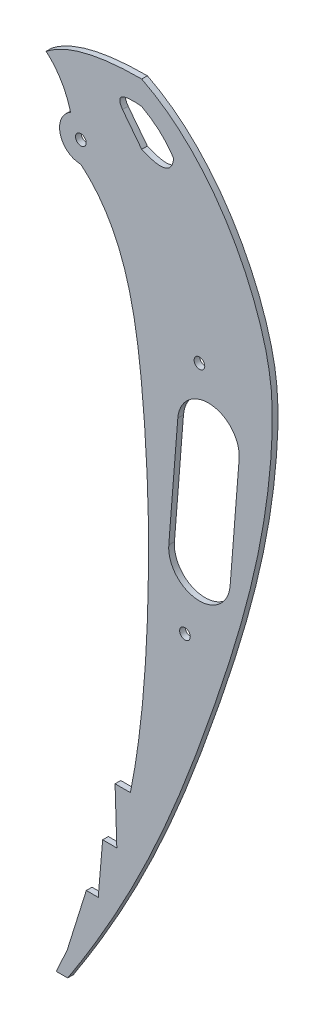
ISO-10303-21;
HEADER;
FILE_DESCRIPTION(('STEP AP214'),'2;1');
FILE_NAME('part.step','',(''),(''),'','','');
FILE_SCHEMA(('AUTOMOTIVE_DESIGN { 1 0 10303 214 1 1 1 1 }'));
ENDSEC;
DATA;
#1=APPLICATION_CONTEXT('core data for automotive mechanical design processes');
#2=APPLICATION_PROTOCOL_DEFINITION('international standard','automotive_design',2000,#1);
#3=PRODUCT_CONTEXT('',#1,'mechanical');
#4=PRODUCT('Part','Part','',(#3));
#5=PRODUCT_RELATED_PRODUCT_CATEGORY('part','',(#4));
#6=PRODUCT_DEFINITION_FORMATION('','',#4);
#7=PRODUCT_DEFINITION_CONTEXT('part definition',#1,'design');
#8=PRODUCT_DEFINITION('design','',#6,#7);
#9=PRODUCT_DEFINITION_SHAPE('','',#8);
#10=(LENGTH_UNIT() NAMED_UNIT(*) SI_UNIT(.MILLI.,.METRE.));
#11=(NAMED_UNIT(*) PLANE_ANGLE_UNIT() SI_UNIT($,.RADIAN.));
#12=(NAMED_UNIT(*) SI_UNIT($,.STERADIAN.) SOLID_ANGLE_UNIT());
#13=UNCERTAINTY_MEASURE_WITH_UNIT(LENGTH_MEASURE(1.E-05),#10,'distance_accuracy_value','');
#14=(GEOMETRIC_REPRESENTATION_CONTEXT(3) GLOBAL_UNCERTAINTY_ASSIGNED_CONTEXT((#13)) GLOBAL_UNIT_ASSIGNED_CONTEXT((#10,
#11,#12)) REPRESENTATION_CONTEXT('',''));
#15=CARTESIAN_POINT('',(0.,0.,0.));
#16=DIRECTION('',(0.,0.,1.));
#17=DIRECTION('',(1.,0.,0.));
#18=AXIS2_PLACEMENT_3D('',#15,#16,#17);
#19=CARTESIAN_POINT('',(-5.41935609574344,-10.162481193457,1.6));
#20=CARTESIAN_POINT('',(-1.88195097163764,-14.5842375985892,1.6));
#21=CARTESIAN_POINT('',(0.,-17.1688407122922,1.6));
#22=B_SPLINE_CURVE_WITH_KNOTS('',2,(#19,#20,#21),.UNSPECIFIED.,.F.,.F.,(3,3),(0.,1.),.UNSPECIFIED.);
#23=DIRECTION('',(0.,0.,-1.));
#24=VECTOR('',#23,1.);
#25=SURFACE_OF_LINEAR_EXTRUSION('',#22,#24);
#26=CARTESIAN_POINT('',(-5.41935609574344,-10.162481193457,0.));
#27=CARTESIAN_POINT('',(-1.88195097163764,-14.5842375985892,0.));
#28=CARTESIAN_POINT('',(0.,-17.1688407122922,0.));
#29=B_SPLINE_CURVE_WITH_KNOTS('',2,(#26,#27,#28),.UNSPECIFIED.,.F.,.F.,(3,3),(0.,1.),.UNSPECIFIED.);
#30=CARTESIAN_POINT('',(-5.41935609574344,-10.162481193457,0.));
#31=VERTEX_POINT('',#30);
#32=CARTESIAN_POINT('',(0.,-17.1688407122922,0.));
#33=VERTEX_POINT('',#32);
#34=EDGE_CURVE('E337',#31,#33,#29,.T.);
#35=ORIENTED_EDGE('',*,*,#34,.F.);
#36=DIRECTION('',(0.,0.,-1.));
#37=VECTOR('',#36,1.);
#38=CARTESIAN_POINT('',(-5.41935609574344,-10.162481193457,1.6));
#39=LINE('',#38,#37);
#40=CARTESIAN_POINT('',(-5.41935609574344,-10.162481193457,1.6));
#41=VERTEX_POINT('',#40);
#42=EDGE_CURVE('E11',#41,#31,#39,.T.);
#43=ORIENTED_EDGE('',*,*,#42,.F.);
#44=CARTESIAN_POINT('',(0.,-17.1688407122922,1.6));
#45=VERTEX_POINT('',#44);
#46=EDGE_CURVE('E200',#41,#45,#22,.T.);
#47=ORIENTED_EDGE('',*,*,#46,.T.);
#48=DIRECTION('',(0.,0.,-1.));
#49=VECTOR('',#48,1.);
#50=CARTESIAN_POINT('',(0.,-17.1688407122922,1.6));
#51=LINE('',#50,#49);
#52=EDGE_CURVE('E56',#45,#33,#51,.T.);
#53=ORIENTED_EDGE('',*,*,#52,.T.);
#54=EDGE_LOOP('',(#35,#43,#47,#53));
#55=FACE_BOUND('',#54,.T.);
#56=ADVANCED_FACE('F37',(#55),#25,.T.);
#57=CARTESIAN_POINT('',(-5.41935609574344,-10.162481193457,1.6));
#58=CARTESIAN_POINT('',(-8.38277856215761,-5.84075309128208,1.6));
#59=CARTESIAN_POINT('',(0.,-6.71629705377271,1.6));
#60=B_SPLINE_CURVE_WITH_KNOTS('',2,(#57,#58,#59),.UNSPECIFIED.,.F.,.F.,(3,3),(0.,1.),.UNSPECIFIED.);
#61=DIRECTION('',(0.,0.,-1.));
#62=VECTOR('',#61,1.);
#63=SURFACE_OF_LINEAR_EXTRUSION('',#60,#62);
#64=CARTESIAN_POINT('',(-5.41935609574344,-10.162481193457,0.));
#65=CARTESIAN_POINT('',(-8.38277856215761,-5.84075309128208,0.));
#66=CARTESIAN_POINT('',(0.,-6.71629705377271,0.));
#67=B_SPLINE_CURVE_WITH_KNOTS('',2,(#64,#65,#66),.UNSPECIFIED.,.F.,.F.,(3,3),(0.,1.),.UNSPECIFIED.);
#68=CARTESIAN_POINT('',(0.,-6.71629705377271,0.));
#69=VERTEX_POINT('',#68);
#70=EDGE_CURVE('E205',#31,#69,#67,.T.);
#71=ORIENTED_EDGE('',*,*,#70,.T.);
#72=DIRECTION('',(0.,0.,-1.));
#73=VECTOR('',#72,1.);
#74=CARTESIAN_POINT('',(0.,-6.71629705377271,1.6));
#75=LINE('',#74,#73);
#76=CARTESIAN_POINT('',(0.,-6.71629705377271,1.6));
#77=VERTEX_POINT('',#76);
#78=EDGE_CURVE('E47',#77,#69,#75,.T.);
#79=ORIENTED_EDGE('',*,*,#78,.F.);
#80=EDGE_CURVE('E195',#41,#77,#60,.T.);
#81=ORIENTED_EDGE('',*,*,#80,.F.);
#82=ORIENTED_EDGE('',*,*,#42,.T.);
#83=EDGE_LOOP('',(#71,#79,#81,#82));
#84=FACE_BOUND('',#83,.T.);
#85=ADVANCED_FACE('F203',(#84),#63,.F.);
#86=CARTESIAN_POINT('',(0.,-6.71629705377271,1.6));
#87=CARTESIAN_POINT('',(5.91198843757165,-9.94948890715059,1.6));
#88=CARTESIAN_POINT('',(8.98701845188216,-14.8810498489991,1.6));
#89=B_SPLINE_CURVE_WITH_KNOTS('',2,(#86,#87,#88),.UNSPECIFIED.,.F.,.F.,(3,3),(0.,1.),.UNSPECIFIED.);
#90=DIRECTION('',(0.,0.,-1.));
#91=VECTOR('',#90,1.);
#92=SURFACE_OF_LINEAR_EXTRUSION('',#89,#91);
#93=CARTESIAN_POINT('',(0.,-6.71629705377271,0.));
#94=CARTESIAN_POINT('',(5.91198843757165,-9.94948890715059,0.));
#95=CARTESIAN_POINT('',(8.98701845188216,-14.8810498489991,0.));
#96=B_SPLINE_CURVE_WITH_KNOTS('',2,(#93,#94,#95),.UNSPECIFIED.,.F.,.F.,(3,3),(0.,1.),.UNSPECIFIED.);
#97=CARTESIAN_POINT('',(8.98701845188216,-14.8810498489991,0.));
#98=VERTEX_POINT('',#97);
#99=EDGE_CURVE('E350',#69,#98,#96,.T.);
#100=ORIENTED_EDGE('',*,*,#99,.T.);
#101=DIRECTION('',(0.,0.,-1.));
#102=VECTOR('',#101,1.);
#103=CARTESIAN_POINT('',(8.98701845188216,-14.8810498489991,1.6));
#104=LINE('',#103,#102);
#105=CARTESIAN_POINT('',(8.98701845188216,-14.8810498489991,1.6));
#106=VERTEX_POINT('',#105);
#107=EDGE_CURVE('E121',#106,#98,#104,.T.);
#108=ORIENTED_EDGE('',*,*,#107,.F.);
#109=EDGE_CURVE('E187',#77,#106,#89,.T.);
#110=ORIENTED_EDGE('',*,*,#109,.F.);
#111=ORIENTED_EDGE('',*,*,#78,.T.);
#112=EDGE_LOOP('',(#100,#108,#110,#111));
#113=FACE_BOUND('',#112,.T.);
#114=ADVANCED_FACE('F189',(#113),#92,.F.);
#115=CARTESIAN_POINT('',(-20.0529924564139,-18.1595476396093,1.6));
#116=CARTESIAN_POINT('',(-21.8935823896308,-11.067218770567,1.6));
#117=CARTESIAN_POINT('',(-26.9696577258909,-6.71629705377271,1.6));
#118=B_SPLINE_CURVE_WITH_KNOTS('',2,(#115,#116,#117),.UNSPECIFIED.,.F.,.F.,(3,3),(0.,1.),.UNSPECIFIED.);
#119=DIRECTION('',(0.,0.,-1.));
#120=VECTOR('',#119,1.);
#121=SURFACE_OF_LINEAR_EXTRUSION('',#118,#120);
#122=CARTESIAN_POINT('',(-20.0529924564139,-18.1595476396093,0.));
#123=CARTESIAN_POINT('',(-21.8935823896308,-11.067218770567,0.));
#124=CARTESIAN_POINT('',(-26.9696577258909,-6.71629705377271,0.));
#125=B_SPLINE_CURVE_WITH_KNOTS('',2,(#122,#123,#124),.UNSPECIFIED.,.F.,.F.,(3,3),(0.,1.),.UNSPECIFIED.);
#126=CARTESIAN_POINT('',(-20.0529924564139,-18.1595476396093,0.));
#127=VERTEX_POINT('',#126);
#128=CARTESIAN_POINT('',(-26.9696577258909,-6.71629705377271,0.));
#129=VERTEX_POINT('',#128);
#130=EDGE_CURVE('E281',#127,#129,#125,.T.);
#131=ORIENTED_EDGE('',*,*,#130,.F.);
#132=DIRECTION('',(0.,0.,-1.));
#133=VECTOR('',#132,1.);
#134=CARTESIAN_POINT('',(-20.0529924564139,-18.1595476396093,1.6));
#135=LINE('',#134,#133);
#136=CARTESIAN_POINT('',(-20.0529924564139,-18.1595476396093,1.6));
#137=VERTEX_POINT('',#136);
#138=EDGE_CURVE('E242',#137,#127,#135,.T.);
#139=ORIENTED_EDGE('',*,*,#138,.F.);
#140=CARTESIAN_POINT('',(-26.9696577258909,-6.71629705377271,1.6));
#141=VERTEX_POINT('',#140);
#142=EDGE_CURVE('E387',#137,#141,#118,.T.);
#143=ORIENTED_EDGE('',*,*,#142,.T.);
#144=DIRECTION('',(0.,0.,-1.));
#145=VECTOR('',#144,1.);
#146=CARTESIAN_POINT('',(-26.9696577258909,-6.71629705377271,1.6));
#147=LINE('',#146,#145);
#148=EDGE_CURVE('E210',#141,#129,#147,.T.);
#149=ORIENTED_EDGE('',*,*,#148,.T.);
#150=EDGE_LOOP('',(#131,#139,#143,#149));
#151=FACE_BOUND('',#150,.T.);
#152=ADVANCED_FACE('F399',(#151),#121,.T.);
#153=CARTESIAN_POINT('',(-17.160324035342,-23.4162071687907,1.6));
#154=DIRECTION('',(0.,0.,-1.));
#155=DIRECTION('',(-1.,0.,0.));
#156=AXIS2_PLACEMENT_3D('',#153,#154,#155);
#157=CYLINDRICAL_SURFACE('',#156,6.);
#158=CARTESIAN_POINT('',(-17.160324035342,-23.4162071687907,0.));
#159=DIRECTION('',(0.,0.,1.));
#160=DIRECTION('',(1.,0.,0.));
#161=AXIS2_PLACEMENT_3D('',#158,#159,#160);
#162=CIRCLE('',#161,6.);
#163=CARTESIAN_POINT('',(-17.160324035342,-29.4162071687907,0.));
#164=VERTEX_POINT('',#163);
#165=EDGE_CURVE('E286',#127,#164,#162,.T.);
#166=ORIENTED_EDGE('',*,*,#165,.T.);
#167=DIRECTION('',(0.,0.,-1.));
#168=VECTOR('',#167,1.);
#169=CARTESIAN_POINT('',(-17.160324035342,-29.4162071687907,1.6));
#170=LINE('',#169,#168);
#171=CARTESIAN_POINT('',(-17.160324035342,-29.4162071687907,1.6));
#172=VERTEX_POINT('',#171);
#173=EDGE_CURVE('E239',#172,#164,#170,.T.);
#174=ORIENTED_EDGE('',*,*,#173,.F.);
#175=CARTESIAN_POINT('',(-17.160324035342,-23.4162071687907,1.6));
#176=DIRECTION('',(0.,0.,1.));
#177=DIRECTION('',(1.,0.,0.));
#178=AXIS2_PLACEMENT_3D('',#175,#176,#177);
#179=CIRCLE('',#178,6.);
#180=EDGE_CURVE('E393',#137,#172,#179,.T.);
#181=ORIENTED_EDGE('',*,*,#180,.F.);
#182=ORIENTED_EDGE('',*,*,#138,.T.);
#183=EDGE_LOOP('',(#166,#174,#181,#182));
#184=FACE_BOUND('',#183,.T.);
#185=ADVANCED_FACE('F403',(#184),#157,.T.);
#186=CARTESIAN_POINT('',(-17.160324035342,-29.4162071687907,1.6));
#187=CARTESIAN_POINT('',(-8.39837101061854,-36.7334757061645,1.6));
#188=CARTESIAN_POINT('',(-2.57158426841968,-52.9686987777936,1.6));
#189=CARTESIAN_POINT('',(0.661081286815977,-79.111086987168,1.6));
#190=CARTESIAN_POINT('',(2.20508208350334,-105.054570558527,1.6));
#191=CARTESIAN_POINT('',(1.83779525450955,-131.716022714708,1.6));
#192=CARTESIAN_POINT('',(0.137887281305669,-155.63401396644,1.6));
#193=CARTESIAN_POINT('',(-1.77194083310882,-168.86774135152,1.6));
#194=CARTESIAN_POINT('',(-3.18703668983481,-175.881884889876,1.6));
#195=B_SPLINE_CURVE_WITH_KNOTS('',3,(#186,#187,#188,#189,#190,#191,#192,#193,#194),
.UNSPECIFIED.,.F.,.F.,(4,1,1,1,1,1,4),(0.,0.158482102906718,0.237210378491598,0.379017678335103,
0.530540030476529,0.619678160333322,0.722683628542991),.UNSPECIFIED.);
#196=DIRECTION('',(0.,0.,-1.));
#197=VECTOR('',#196,1.);
#198=SURFACE_OF_LINEAR_EXTRUSION('',#195,#197);
#199=CARTESIAN_POINT('',(-17.160324035342,-29.4162071687907,0.));
#200=CARTESIAN_POINT('',(-8.39837101061854,-36.7334757061645,0.));
#201=CARTESIAN_POINT('',(-2.57158426841968,-52.9686987777936,0.));
#202=CARTESIAN_POINT('',(0.661081286815977,-79.111086987168,0.));
#203=CARTESIAN_POINT('',(2.20508208350334,-105.054570558527,0.));
#204=CARTESIAN_POINT('',(1.83779525450955,-131.716022714708,0.));
#205=CARTESIAN_POINT('',(0.137887281305669,-155.63401396644,0.));
#206=CARTESIAN_POINT('',(-1.77194083310882,-168.86774135152,0.));
#207=CARTESIAN_POINT('',(-3.18703668983481,-175.881884889876,0.));
#208=B_SPLINE_CURVE_WITH_KNOTS('',3,(#199,#200,#201,#202,#203,#204,#205,#206,#207),
.UNSPECIFIED.,.F.,.F.,(4,1,1,1,1,1,4),(0.,0.158482102906718,0.237210378491598,0.379017678335103,
0.530540030476529,0.619678160333322,0.722683628542991),.UNSPECIFIED.);
#209=CARTESIAN_POINT('',(-3.18703668983481,-175.881884889876,0.));
#210=VERTEX_POINT('',#209);
#211=EDGE_CURVE('E292',#164,#210,#208,.T.);
#212=ORIENTED_EDGE('',*,*,#211,.T.);
#213=DIRECTION('',(0.,0.,-1.));
#214=VECTOR('',#213,1.);
#215=CARTESIAN_POINT('',(-3.18703668983481,-175.881884889876,1.6));
#216=LINE('',#215,#214);
#217=CARTESIAN_POINT('',(-3.18703668983481,-175.881884889876,1.6));
#218=VERTEX_POINT('',#217);
#219=EDGE_CURVE('E236',#218,#210,#216,.T.);
#220=ORIENTED_EDGE('',*,*,#219,.F.);
#221=EDGE_CURVE('E497',#172,#218,#195,.T.);
#222=ORIENTED_EDGE('',*,*,#221,.F.);
#223=ORIENTED_EDGE('',*,*,#173,.T.);
#224=EDGE_LOOP('',(#212,#220,#222,#223));
#225=FACE_BOUND('',#224,.T.);
#226=ADVANCED_FACE('F510',(#225),#198,.F.);
#227=CARTESIAN_POINT('',(0.,-175.881884889876,1.6));
#228=DIRECTION('',(0.,-1.,0.));
#229=DIRECTION('',(0.,0.,-1.));
#230=AXIS2_PLACEMENT_3D('',#227,#228,#229);
#231=PLANE('',#230);
#232=DIRECTION('',(-1.,0.,0.));
#233=VECTOR('',#232,1.);
#234=CARTESIAN_POINT('',(0.,-175.881884889876,0.));
#235=LINE('',#234,#233);
#236=CARTESIAN_POINT('',(-7.51601253221282,-175.881884889876,0.));
#237=VERTEX_POINT('',#236);
#238=EDGE_CURVE('E297',#210,#237,#235,.T.);
#239=ORIENTED_EDGE('',*,*,#238,.T.);
#240=DIRECTION('',(0.,0.,-1.));
#241=VECTOR('',#240,1.);
#242=CARTESIAN_POINT('',(-7.51601253221282,-175.881884889876,1.6));
#243=LINE('',#242,#241);
#244=CARTESIAN_POINT('',(-7.51601253221282,-175.881884889876,1.6));
#245=VERTEX_POINT('',#244);
#246=EDGE_CURVE('E233',#245,#237,#243,.T.);
#247=ORIENTED_EDGE('',*,*,#246,.F.);
#248=DIRECTION('',(-1.,0.,0.));
#249=VECTOR('',#248,1.);
#250=CARTESIAN_POINT('',(0.,-175.881884889876,1.6));
#251=LINE('',#250,#249);
#252=EDGE_CURVE('E498',#218,#245,#251,.T.);
#253=ORIENTED_EDGE('',*,*,#252,.F.);
#254=ORIENTED_EDGE('',*,*,#219,.T.);
#255=EDGE_LOOP('',(#239,#247,#253,#254));
#256=FACE_BOUND('',#255,.T.);
#257=ADVANCED_FACE('F513',(#256),#231,.F.);
#258=CARTESIAN_POINT('',(-13.1552459237664,-0.422808004032004,1.6));
#259=DIRECTION('',(0.999483913901284,0.0321232914342744,0.));
#260=DIRECTION('',(-0.0321232914342744,0.999483913901284,0.));
#261=AXIS2_PLACEMENT_3D('',#258,#259,#260);
#262=PLANE('',#261);
#263=DIRECTION('',(0.0321232914342744,-0.999483913901284,0.));
#264=VECTOR('',#263,1.);
#265=CARTESIAN_POINT('',(-13.1552459237664,-0.422808004032004,0.));
#266=LINE('',#265,#264);
#267=CARTESIAN_POINT('',(-7.02010282232688,-191.311616889555,0.));
#268=VERTEX_POINT('',#267);
#269=EDGE_CURVE('E303',#237,#268,#266,.T.);
#270=ORIENTED_EDGE('',*,*,#269,.T.);
#271=DIRECTION('',(0.,0.,-1.));
#272=VECTOR('',#271,1.);
#273=CARTESIAN_POINT('',(-7.02010282232688,-191.311616889555,1.6));
#274=LINE('',#273,#272);
#275=CARTESIAN_POINT('',(-7.02010282232688,-191.311616889555,1.6));
#276=VERTEX_POINT('',#275);
#277=EDGE_CURVE('E230',#276,#268,#274,.T.);
#278=ORIENTED_EDGE('',*,*,#277,.F.);
#279=DIRECTION('',(0.0321232914342744,-0.999483913901284,0.));
#280=VECTOR('',#279,1.);
#281=CARTESIAN_POINT('',(-13.1552459237664,-0.422808004032004,1.6));
#282=LINE('',#281,#280);
#283=EDGE_CURVE('E501',#245,#276,#282,.T.);
#284=ORIENTED_EDGE('',*,*,#283,.F.);
#285=ORIENTED_EDGE('',*,*,#246,.T.);
#286=EDGE_LOOP('',(#270,#278,#284,#285));
#287=FACE_BOUND('',#286,.T.);
#288=ADVANCED_FACE('F517',(#287),#262,.F.);
#289=CARTESIAN_POINT('',(0.,-191.311616889555,1.6));
#290=DIRECTION('',(0.,-1.,0.));
#291=DIRECTION('',(0.,0.,-1.));
#292=AXIS2_PLACEMENT_3D('',#289,#290,#291);
#293=PLANE('',#292);
#294=DIRECTION('',(-1.,0.,0.));
#295=VECTOR('',#294,1.);
#296=CARTESIAN_POINT('',(0.,-191.311616889555,0.));
#297=LINE('',#296,#295);
#298=CARTESIAN_POINT('',(-11.0217381598174,-191.311616889555,0.));
#299=VERTEX_POINT('',#298);
#300=EDGE_CURVE('E306',#268,#299,#297,.T.);
#301=ORIENTED_EDGE('',*,*,#300,.T.);
#302=DIRECTION('',(0.,0.,-1.));
#303=VECTOR('',#302,1.);
#304=CARTESIAN_POINT('',(-11.0217381598174,-191.311616889555,1.6));
#305=LINE('',#304,#303);
#306=CARTESIAN_POINT('',(-11.0217381598174,-191.311616889555,1.6));
#307=VERTEX_POINT('',#306);
#308=EDGE_CURVE('E227',#307,#299,#305,.T.);
#309=ORIENTED_EDGE('',*,*,#308,.F.);
#310=DIRECTION('',(-1.,0.,0.));
#311=VECTOR('',#310,1.);
#312=CARTESIAN_POINT('',(0.,-191.311616889555,1.6));
#313=LINE('',#312,#311);
#314=EDGE_CURVE('E570',#276,#307,#313,.T.);
#315=ORIENTED_EDGE('',*,*,#314,.F.);
#316=ORIENTED_EDGE('',*,*,#277,.T.);
#317=EDGE_LOOP('',(#301,#309,#315,#316));
#318=FACE_BOUND('',#317,.T.);
#319=ADVANCED_FACE('F521',(#318),#293,.F.);
#320=CARTESIAN_POINT('',(5.06343246458469,-0.426676798594854,1.6));
#321=DIRECTION('',(0.996468390898167,-0.083968720014175,0.));
#322=DIRECTION('',(0.083968720014175,0.996468390898166,0.));
#323=AXIS2_PLACEMENT_3D('',#320,#321,#322);
#324=PLANE('',#323);
#325=DIRECTION('',(-0.083968720014175,-0.996468390898167,0.));
#326=VECTOR('',#325,1.);
#327=CARTESIAN_POINT('',(5.06343246458469,-0.426676798594854,0.));
#328=LINE('',#327,#326);
#329=CARTESIAN_POINT('',(-12.2589606060334,-205.993906436851,0.));
#330=VERTEX_POINT('',#329);
#331=EDGE_CURVE('E309',#299,#330,#328,.T.);
#332=ORIENTED_EDGE('',*,*,#331,.T.);
#333=DIRECTION('',(0.,0.,-1.));
#334=VECTOR('',#333,1.);
#335=CARTESIAN_POINT('',(-12.2589606060334,-205.993906436851,1.6));
#336=LINE('',#335,#334);
#337=CARTESIAN_POINT('',(-12.2589606060334,-205.993906436851,1.6));
#338=VERTEX_POINT('',#337);
#339=EDGE_CURVE('E224',#338,#330,#336,.T.);
#340=ORIENTED_EDGE('',*,*,#339,.F.);
#341=DIRECTION('',(-0.083968720014175,-0.996468390898167,0.));
#342=VECTOR('',#341,1.);
#343=CARTESIAN_POINT('',(5.06343246458469,-0.426676798594854,1.6));
#344=LINE('',#343,#342);
#345=EDGE_CURVE('E567',#307,#338,#344,.T.);
#346=ORIENTED_EDGE('',*,*,#345,.F.);
#347=ORIENTED_EDGE('',*,*,#308,.T.);
#348=EDGE_LOOP('',(#332,#340,#346,#347));
#349=FACE_BOUND('',#348,.T.);
#350=ADVANCED_FACE('F525',(#349),#324,.F.);
#351=CARTESIAN_POINT('',(0.,-205.993906436851,1.6));
#352=DIRECTION('',(0.,-1.,0.));
#353=DIRECTION('',(0.,0.,-1.));
#354=AXIS2_PLACEMENT_3D('',#351,#352,#353);
#355=PLANE('',#354);
#356=DIRECTION('',(-1.,0.,0.));
#357=VECTOR('',#356,1.);
#358=CARTESIAN_POINT('',(0.,-205.993906436851,0.));
#359=LINE('',#358,#357);
#360=CARTESIAN_POINT('',(-15.6230030460485,-205.993906436851,0.));
#361=VERTEX_POINT('',#360);
#362=EDGE_CURVE('E312',#330,#361,#359,.T.);
#363=ORIENTED_EDGE('',*,*,#362,.T.);
#364=DIRECTION('',(0.,0.,-1.));
#365=VECTOR('',#364,1.);
#366=CARTESIAN_POINT('',(-15.6230030460485,-205.993906436851,1.6));
#367=LINE('',#366,#365);
#368=CARTESIAN_POINT('',(-15.6230030460485,-205.993906436851,1.6));
#369=VERTEX_POINT('',#368);
#370=EDGE_CURVE('E221',#369,#361,#367,.T.);
#371=ORIENTED_EDGE('',*,*,#370,.F.);
#372=DIRECTION('',(-1.,0.,0.));
#373=VECTOR('',#372,1.);
#374=CARTESIAN_POINT('',(0.,-205.993906436851,1.6));
#375=LINE('',#374,#373);
#376=EDGE_CURVE('E564',#338,#369,#375,.T.);
#377=ORIENTED_EDGE('',*,*,#376,.F.);
#378=ORIENTED_EDGE('',*,*,#339,.T.);
#379=EDGE_LOOP('',(#363,#371,#377,#378));
#380=FACE_BOUND('',#379,.T.);
#381=ADVANCED_FACE('F529',(#380),#355,.F.);
#382=CARTESIAN_POINT('',(44.4261041788893,-13.8867715394829,1.6));
#383=DIRECTION('',(0.954457870523093,-0.298345727967609,0.));
#384=DIRECTION('',(0.298345727967609,0.954457870523093,0.));
#385=AXIS2_PLACEMENT_3D('',#382,#383,#384);
#386=PLANE('',#385);
#387=DIRECTION('',(-0.298345727967609,-0.954457870523093,0.));
#388=VECTOR('',#387,1.);
#389=CARTESIAN_POINT('',(44.4261041788893,-13.8867715394829,0.));
#390=LINE('',#389,#388);
#391=CARTESIAN_POINT('',(-21.0272185928794,-223.282895616666,0.));
#392=VERTEX_POINT('',#391);
#393=EDGE_CURVE('E315',#361,#392,#390,.T.);
#394=ORIENTED_EDGE('',*,*,#393,.T.);
#395=DIRECTION('',(0.,0.,-1.));
#396=VECTOR('',#395,1.);
#397=CARTESIAN_POINT('',(-21.0272185928794,-223.282895616666,1.6));
#398=LINE('',#397,#396);
#399=CARTESIAN_POINT('',(-21.0272185928794,-223.282895616666,1.6));
#400=VERTEX_POINT('',#399);
#401=EDGE_CURVE('E218',#400,#392,#398,.T.);
#402=ORIENTED_EDGE('',*,*,#401,.F.);
#403=DIRECTION('',(-0.298345727967609,-0.954457870523093,0.));
#404=VECTOR('',#403,1.);
#405=CARTESIAN_POINT('',(44.4261041788893,-13.8867715394829,1.6));
#406=LINE('',#405,#404);
#407=EDGE_CURVE('E561',#369,#400,#406,.T.);
#408=ORIENTED_EDGE('',*,*,#407,.F.);
#409=ORIENTED_EDGE('',*,*,#370,.T.);
#410=EDGE_LOOP('',(#394,#402,#408,#409));
#411=FACE_BOUND('',#410,.T.);
#412=ADVANCED_FACE('F533',(#411),#386,.F.);
#413=CARTESIAN_POINT('',(67.2296065256395,-30.8309210013598,1.6));
#414=DIRECTION('',(0.908975944313388,-0.416848572817018,0.));
#415=DIRECTION('',(0.416848572817018,0.908975944313388,0.));
#416=AXIS2_PLACEMENT_3D('',#413,#414,#415);
#417=PLANE('',#416);
#418=DIRECTION('',(-0.416848572817018,-0.908975944313388,0.));
#419=VECTOR('',#418,1.);
#420=CARTESIAN_POINT('',(67.2296065256395,-30.8309210013598,0.));
#421=LINE('',#420,#419);
#422=CARTESIAN_POINT('',(-24.1076250581691,-230.,0.));
#423=VERTEX_POINT('',#422);
#424=EDGE_CURVE('E318',#392,#423,#421,.T.);
#425=ORIENTED_EDGE('',*,*,#424,.T.);
#426=DIRECTION('',(0.,0.,-1.));
#427=VECTOR('',#426,1.);
#428=CARTESIAN_POINT('',(-24.1076250581691,-230.,1.6));
#429=LINE('',#428,#427);
#430=CARTESIAN_POINT('',(-24.1076250581691,-230.,1.6));
#431=VERTEX_POINT('',#430);
#432=EDGE_CURVE('E216',#431,#423,#429,.T.);
#433=ORIENTED_EDGE('',*,*,#432,.F.);
#434=DIRECTION('',(-0.416848572817018,-0.908975944313388,0.));
#435=VECTOR('',#434,1.);
#436=CARTESIAN_POINT('',(67.2296065256395,-30.8309210013598,1.6));
#437=LINE('',#436,#435);
#438=EDGE_CURVE('E559',#400,#431,#437,.T.);
#439=ORIENTED_EDGE('',*,*,#438,.F.);
#440=ORIENTED_EDGE('',*,*,#401,.T.);
#441=EDGE_LOOP('',(#425,#433,#439,#440));
#442=FACE_BOUND('',#441,.T.);
#443=ADVANCED_FACE('F537',(#442),#417,.F.);
#444=CARTESIAN_POINT('',(0.,-230.,1.6));
#445=DIRECTION('',(0.,-1.,0.));
#446=DIRECTION('',(0.,0.,-1.));
#447=AXIS2_PLACEMENT_3D('',#444,#445,#446);
#448=PLANE('',#447);
#449=DIRECTION('',(-1.,0.,0.));
#450=VECTOR('',#449,1.);
#451=CARTESIAN_POINT('',(0.,-230.,0.));
#452=LINE('',#451,#450);
#453=CARTESIAN_POINT('',(-20.8747621989633,-230.,0.));
#454=VERTEX_POINT('',#453);
#455=EDGE_CURVE('E321',#454,#423,#452,.T.);
#456=ORIENTED_EDGE('',*,*,#455,.F.);
#457=DIRECTION('',(0.,0.,-1.));
#458=VECTOR('',#457,1.);
#459=CARTESIAN_POINT('',(-20.8747621989633,-230.,1.6));
#460=LINE('',#459,#458);
#461=CARTESIAN_POINT('',(-20.8747621989633,-230.,1.6));
#462=VERTEX_POINT('',#461);
#463=EDGE_CURVE('E214',#462,#454,#460,.T.);
#464=ORIENTED_EDGE('',*,*,#463,.F.);
#465=DIRECTION('',(-1.,0.,0.));
#466=VECTOR('',#465,1.);
#467=CARTESIAN_POINT('',(0.,-230.,1.6));
#468=LINE('',#467,#466);
#469=EDGE_CURVE('E553',#462,#431,#468,.T.);
#470=ORIENTED_EDGE('',*,*,#469,.T.);
#471=ORIENTED_EDGE('',*,*,#432,.T.);
#472=EDGE_LOOP('',(#456,#464,#470,#471));
#473=FACE_BOUND('',#472,.T.);
#474=ADVANCED_FACE('F541',(#473),#448,.T.);
#475=CARTESIAN_POINT('',(0.,0.,1.6));
#476=CARTESIAN_POINT('',(20.4595753055473,-10.2121918467981,1.6));
#477=CARTESIAN_POINT('',(34.5662851941913,-39.2317131576054,1.6));
#478=CARTESIAN_POINT('',(36.9930524523849,-61.4677114831442,1.6));
#479=CARTESIAN_POINT('',(36.2263830181213,-93.4939225691744,1.6));
#480=CARTESIAN_POINT('',(19.7597907232029,-148.871722199701,1.6));
#481=CARTESIAN_POINT('',(-0.764820519320112,-199.159242316598,1.6));
#482=CARTESIAN_POINT('',(-20.8747621989633,-230.,1.6));
#483=B_SPLINE_CURVE_WITH_KNOTS('',3,(#475,#476,#477,#478,#479,#480,#481,#482),.UNSPECIFIED.,.F.,
.F.,(4,1,1,1,1,4),(0.,0.214563454030827,0.244193693047157,0.296302390163298,0.63393732805005,
1.),.UNSPECIFIED.);
#484=DIRECTION('',(0.,0.,-1.));
#485=VECTOR('',#484,1.);
#486=SURFACE_OF_LINEAR_EXTRUSION('',#483,#485);
#487=CARTESIAN_POINT('',(0.,0.,0.));
#488=CARTESIAN_POINT('',(20.4595753055473,-10.2121918467981,0.));
#489=CARTESIAN_POINT('',(34.5662851941913,-39.2317131576054,0.));
#490=CARTESIAN_POINT('',(36.9930524523849,-61.4677114831442,0.));
#491=CARTESIAN_POINT('',(36.2263830181213,-93.4939225691744,0.));
#492=CARTESIAN_POINT('',(19.7597907232029,-148.871722199701,0.));
#493=CARTESIAN_POINT('',(-0.764820519320112,-199.159242316598,0.));
#494=CARTESIAN_POINT('',(-20.8747621989633,-230.,0.));
#495=B_SPLINE_CURVE_WITH_KNOTS('',3,(#487,#488,#489,#490,#491,#492,#493,#494),.UNSPECIFIED.,.F.,
.F.,(4,1,1,1,1,4),(0.,0.214563454030827,0.244193693047157,0.296302390163298,0.63393732805005,
1.),.UNSPECIFIED.);
#496=CARTESIAN_POINT('',(0.,0.,0.));
#497=VERTEX_POINT('',#496);
#498=EDGE_CURVE('E324',#497,#454,#495,.T.);
#499=ORIENTED_EDGE('',*,*,#498,.F.);
#500=DIRECTION('',(0.,0.,-1.));
#501=VECTOR('',#500,1.);
#502=CARTESIAN_POINT('',(0.,0.,1.6));
#503=LINE('',#502,#501);
#504=CARTESIAN_POINT('',(0.,0.,1.6));
#505=VERTEX_POINT('',#504);
#506=EDGE_CURVE('E212',#505,#497,#503,.T.);
#507=ORIENTED_EDGE('',*,*,#506,.F.);
#508=EDGE_CURVE('E547',#505,#462,#483,.T.);
#509=ORIENTED_EDGE('',*,*,#508,.T.);
#510=ORIENTED_EDGE('',*,*,#463,.T.);
#511=EDGE_LOOP('',(#499,#507,#509,#510));
#512=FACE_BOUND('',#511,.T.);
#513=ADVANCED_FACE('F422',(#512),#486,.T.);
#514=CARTESIAN_POINT('',(16.2801657128775,-110.65523614991,1.6));
#515=DIRECTION('',(0.,0.,-1.));
#516=DIRECTION('',(-1.,0.,0.));
#517=AXIS2_PLACEMENT_3D('',#514,#515,#516);
#518=CYLINDRICAL_SURFACE('',#517,8.67496910401254);
#519=CARTESIAN_POINT('',(16.2801657128775,-110.65523614991,0.));
#520=DIRECTION('',(0.,0.,1.));
#521=DIRECTION('',(1.,0.,0.));
#522=AXIS2_PLACEMENT_3D('',#519,#520,#521);
#523=CIRCLE('',#522,8.67496910401254);
#524=CARTESIAN_POINT('',(7.63218347510054,-109.971502158751,0.));
#525=VERTEX_POINT('',#524);
#526=CARTESIAN_POINT('',(24.9281479506546,-111.338970141068,0.));
#527=VERTEX_POINT('',#526);
#528=EDGE_CURVE('E261',#525,#527,#523,.T.);
#529=ORIENTED_EDGE('',*,*,#528,.F.);
#530=DIRECTION('',(0.,0.,-1.));
#531=VECTOR('',#530,1.);
#532=CARTESIAN_POINT('',(7.63218347510054,-109.971502158751,1.6));
#533=LINE('',#532,#531);
#534=CARTESIAN_POINT('',(7.63218347510054,-109.971502158751,1.6));
#535=VERTEX_POINT('',#534);
#536=EDGE_CURVE('E41',#535,#525,#533,.T.);
#537=ORIENTED_EDGE('',*,*,#536,.F.);
#538=CARTESIAN_POINT('',(16.2801657128775,-110.65523614991,1.6));
#539=DIRECTION('',(0.,0.,1.));
#540=DIRECTION('',(1.,0.,0.));
#541=AXIS2_PLACEMENT_3D('',#538,#539,#540);
#542=CIRCLE('',#541,8.67496910401254);
#543=CARTESIAN_POINT('',(24.9281479506546,-111.338970141068,1.6));
#544=VERTEX_POINT('',#543);
#545=EDGE_CURVE('E375',#535,#544,#542,.T.);
#546=ORIENTED_EDGE('',*,*,#545,.T.);
#547=DIRECTION('',(0.,0.,-1.));
#548=VECTOR('',#547,1.);
#549=CARTESIAN_POINT('',(24.9281479506546,-111.338970141068,1.6));
#550=LINE('',#549,#548);
#551=EDGE_CURVE('E244',#544,#527,#550,.T.);
#552=ORIENTED_EDGE('',*,*,#551,.T.);
#553=EDGE_LOOP('',(#529,#537,#546,#552));
#554=FACE_BOUND('',#553,.T.);
#555=ADVANCED_FACE('F262',(#554),#518,.F.);
#556=CARTESIAN_POINT('',(16.2254182013621,-1.28282755907743,1.6));
#557=DIRECTION('',(0.996889110968355,-0.0788168791105212,0.));
#558=DIRECTION('',(0.0788168791105212,0.996889110968355,0.));
#559=AXIS2_PLACEMENT_3D('',#556,#557,#558);
#560=PLANE('',#559);
#561=DIRECTION('',(-0.0788168791105213,-0.996889110968355,0.));
#562=VECTOR('',#561,1.);
#563=CARTESIAN_POINT('',(16.2254182013621,-1.28282755907743,0.));
#564=LINE('',#563,#562);
#565=CARTESIAN_POINT('',(10.1832179276029,-77.7055903882711,0.));
#566=VERTEX_POINT('',#565);
#567=EDGE_CURVE('E256',#566,#525,#564,.T.);
#568=ORIENTED_EDGE('',*,*,#567,.F.);
#569=DIRECTION('',(0.,0.,-1.));
#570=VECTOR('',#569,1.);
#571=CARTESIAN_POINT('',(10.1832179276029,-77.7055903882711,1.6));
#572=LINE('',#571,#570);
#573=CARTESIAN_POINT('',(10.1832179276029,-77.7055903882711,1.6));
#574=VERTEX_POINT('',#573);
#575=EDGE_CURVE('E247',#574,#566,#572,.T.);
#576=ORIENTED_EDGE('',*,*,#575,.F.);
#577=DIRECTION('',(-0.0788168791105213,-0.996889110968355,0.));
#578=VECTOR('',#577,1.);
#579=CARTESIAN_POINT('',(16.2254182013621,-1.28282755907743,1.6));
#580=LINE('',#579,#578);
#581=EDGE_CURVE('E259',#574,#535,#580,.T.);
#582=ORIENTED_EDGE('',*,*,#581,.T.);
#583=ORIENTED_EDGE('',*,*,#536,.T.);
#584=EDGE_LOOP('',(#568,#576,#582,#583));
#585=FACE_BOUND('',#584,.T.);
#586=ADVANCED_FACE('F254',(#585),#560,.T.);
#587=CARTESIAN_POINT('',(18.8312001653799,-78.3893243794296,1.6));
#588=DIRECTION('',(0.,0.,-1.));
#589=DIRECTION('',(-1.,0.,0.));
#590=AXIS2_PLACEMENT_3D('',#587,#588,#589);
#591=CYLINDRICAL_SURFACE('',#590,8.67496910401254);
#592=CARTESIAN_POINT('',(18.8312001653799,-78.3893243794296,0.));
#593=DIRECTION('',(0.,0.,1.));
#594=DIRECTION('',(1.,0.,0.));
#595=AXIS2_PLACEMENT_3D('',#592,#593,#594);
#596=CIRCLE('',#595,8.67496910401254);
#597=CARTESIAN_POINT('',(27.4791824031569,-79.073058370588,0.));
#598=VERTEX_POINT('',#597);
#599=EDGE_CURVE('E271',#598,#566,#596,.T.);
#600=ORIENTED_EDGE('',*,*,#599,.F.);
#601=DIRECTION('',(0.,0.,-1.));
#602=VECTOR('',#601,1.);
#603=CARTESIAN_POINT('',(27.4791824031569,-79.073058370588,1.6));
#604=LINE('',#603,#602);
#605=CARTESIAN_POINT('',(27.4791824031569,-79.073058370588,1.6));
#606=VERTEX_POINT('',#605);
#607=EDGE_CURVE('E246',#606,#598,#604,.T.);
#608=ORIENTED_EDGE('',*,*,#607,.F.);
#609=CARTESIAN_POINT('',(18.8312001653799,-78.3893243794296,1.6));
#610=DIRECTION('',(0.,0.,1.));
#611=DIRECTION('',(1.,0.,0.));
#612=AXIS2_PLACEMENT_3D('',#609,#610,#611);
#613=CIRCLE('',#612,8.67496910401254);
#614=EDGE_CURVE('E380',#606,#574,#613,.T.);
#615=ORIENTED_EDGE('',*,*,#614,.T.);
#616=ORIENTED_EDGE('',*,*,#575,.T.);
#617=EDGE_LOOP('',(#600,#608,#615,#616));
#618=FACE_BOUND('',#617,.T.);
#619=ADVANCED_FACE('F416',(#618),#591,.F.);
#620=CARTESIAN_POINT('',(0.,0.,1.6));
#621=CARTESIAN_POINT('',(-18.413441465894,0.0164632819625606,1.6));
#622=CARTESIAN_POINT('',(-26.9696577258909,-6.71629705377271,1.6));
#623=B_SPLINE_CURVE_WITH_KNOTS('',2,(#620,#621,#622),.UNSPECIFIED.,.F.,.F.,(3,3),(0.,1.),.UNSPECIFIED.);
#624=DIRECTION('',(0.,0.,-1.));
#625=VECTOR('',#624,1.);
#626=SURFACE_OF_LINEAR_EXTRUSION('',#623,#625);
#627=CARTESIAN_POINT('',(0.,0.,0.));
#628=CARTESIAN_POINT('',(-18.413441465894,0.0164632819625606,0.));
#629=CARTESIAN_POINT('',(-26.9696577258909,-6.71629705377271,0.));
#630=B_SPLINE_CURVE_WITH_KNOTS('',2,(#627,#628,#629),.UNSPECIFIED.,.F.,.F.,(3,3),(0.,1.),.UNSPECIFIED.);
#631=EDGE_CURVE('E329',#497,#129,#630,.T.);
#632=ORIENTED_EDGE('',*,*,#631,.T.);
#633=ORIENTED_EDGE('',*,*,#148,.F.);
#634=EDGE_CURVE('E444',#505,#141,#623,.T.);
#635=ORIENTED_EDGE('',*,*,#634,.F.);
#636=ORIENTED_EDGE('',*,*,#506,.T.);
#637=EDGE_LOOP('',(#632,#633,#635,#636));
#638=FACE_BOUND('',#637,.T.);
#639=ADVANCED_FACE('F410',(#638),#626,.F.);
#640=CARTESIAN_POINT('',(12.193485529504,-129.398093125515,1.6));
#641=DIRECTION('',(0.,0.,-1.));
#642=DIRECTION('',(-1.,0.,0.));
#643=AXIS2_PLACEMENT_3D('',#640,#641,#642);
#644=CYLINDRICAL_SURFACE('',#643,1.5);
#645=CARTESIAN_POINT('',(12.193485529504,-129.398093125515,1.6));
#646=DIRECTION('',(0.,0.,1.));
#647=DIRECTION('',(1.,0.,0.));
#648=AXIS2_PLACEMENT_3D('',#645,#646,#647);
#649=CIRCLE('',#648,1.5);
#650=CARTESIAN_POINT('',(13.693485529504,-129.398093125515,1.6));
#651=VERTEX_POINT('',#650);
#652=EDGE_CURVE('E384',#651,#651,#649,.T.);
#653=ORIENTED_EDGE('',*,*,#652,.T.);
#654=EDGE_LOOP('',(#653));
#655=FACE_BOUND('',#654,.T.);
#656=CARTESIAN_POINT('',(12.193485529504,-129.398093125515,0.));
#657=DIRECTION('',(0.,0.,1.));
#658=DIRECTION('',(1.,0.,0.));
#659=AXIS2_PLACEMENT_3D('',#656,#657,#658);
#660=CIRCLE('',#659,1.5);
#661=CARTESIAN_POINT('',(13.693485529504,-129.398093125515,0.));
#662=VERTEX_POINT('',#661);
#663=EDGE_CURVE('E278',#662,#662,#660,.T.);
#664=ORIENTED_EDGE('',*,*,#663,.F.);
#665=EDGE_LOOP('',(#664));
#666=FACE_BOUND('',#665,.T.);
#667=ADVANCED_FACE('F406',(#655,#666),#644,.F.);
#668=CARTESIAN_POINT('',(33.5213826769161,-2.65029554139436,1.6));
#669=DIRECTION('',(0.996889110968355,-0.0788168791105212,0.));
#670=DIRECTION('',(0.0788168791105212,0.996889110968355,0.));
#671=AXIS2_PLACEMENT_3D('',#668,#669,#670);
#672=PLANE('',#671);
#673=DIRECTION('',(-0.0788168791105213,-0.996889110968355,0.));
#674=VECTOR('',#673,1.);
#675=CARTESIAN_POINT('',(33.5213826769161,-2.65029554139436,0.));
#676=LINE('',#675,#674);
#677=EDGE_CURVE('E273',#598,#527,#676,.T.);
#678=ORIENTED_EDGE('',*,*,#677,.T.);
#679=ORIENTED_EDGE('',*,*,#551,.F.);
#680=DIRECTION('',(-0.0788168791105213,-0.996889110968355,0.));
#681=VECTOR('',#680,1.);
#682=CARTESIAN_POINT('',(33.5213826769161,-2.65029554139436,1.6));
#683=LINE('',#682,#681);
#684=EDGE_CURVE('E382',#606,#544,#683,.T.);
#685=ORIENTED_EDGE('',*,*,#684,.F.);
#686=ORIENTED_EDGE('',*,*,#607,.T.);
#687=EDGE_LOOP('',(#678,#679,#685,#686));
#688=FACE_BOUND('',#687,.T.);
#689=ADVANCED_FACE('F409',(#688),#672,.F.);
#690=CARTESIAN_POINT('',(16.2801657128775,-61.2394740926396,1.6));
#691=DIRECTION('',(0.,0.,-1.));
#692=DIRECTION('',(-1.,0.,0.));
#693=AXIS2_PLACEMENT_3D('',#690,#691,#692);
#694=CYLINDRICAL_SURFACE('',#693,1.5);
#695=CARTESIAN_POINT('',(16.2801657128775,-61.2394740926396,1.6));
#696=DIRECTION('',(0.,0.,1.));
#697=DIRECTION('',(1.,0.,0.));
#698=AXIS2_PLACEMENT_3D('',#695,#696,#697);
#699=CIRCLE('',#698,1.5);
#700=CARTESIAN_POINT('',(17.7801657128775,-61.2394740926396,1.6));
#701=VERTEX_POINT('',#700);
#702=EDGE_CURVE('E370',#701,#701,#699,.T.);
#703=ORIENTED_EDGE('',*,*,#702,.T.);
#704=EDGE_LOOP('',(#703));
#705=FACE_BOUND('',#704,.T.);
#706=CARTESIAN_POINT('',(16.2801657128775,-61.2394740926396,0.));
#707=DIRECTION('',(0.,0.,1.));
#708=DIRECTION('',(1.,0.,0.));
#709=AXIS2_PLACEMENT_3D('',#706,#707,#708);
#710=CIRCLE('',#709,1.5);
#711=CARTESIAN_POINT('',(17.7801657128775,-61.2394740926396,0.));
#712=VERTEX_POINT('',#711);
#713=EDGE_CURVE('E267',#712,#712,#710,.T.);
#714=ORIENTED_EDGE('',*,*,#713,.F.);
#715=EDGE_LOOP('',(#714));
#716=FACE_BOUND('',#715,.T.);
#717=ADVANCED_FACE('F414',(#705,#716),#694,.F.);
#718=CARTESIAN_POINT('',(-17.160324035342,-23.4162071687907,1.6));
#719=DIRECTION('',(0.,0.,-1.));
#720=DIRECTION('',(-1.,0.,0.));
#721=AXIS2_PLACEMENT_3D('',#718,#719,#720);
#722=CYLINDRICAL_SURFACE('',#721,1.5);
#723=CARTESIAN_POINT('',(-17.160324035342,-23.4162071687907,1.6));
#724=DIRECTION('',(0.,0.,1.));
#725=DIRECTION('',(1.,0.,0.));
#726=AXIS2_PLACEMENT_3D('',#723,#724,#725);
#727=CIRCLE('',#726,1.5);
#728=CARTESIAN_POINT('',(-15.660324035342,-23.4162071687907,1.6));
#729=VERTEX_POINT('',#728);
#730=EDGE_CURVE('E364',#729,#729,#727,.T.);
#731=ORIENTED_EDGE('',*,*,#730,.T.);
#732=EDGE_LOOP('',(#731));
#733=FACE_BOUND('',#732,.T.);
#734=CARTESIAN_POINT('',(-17.160324035342,-23.4162071687907,0.));
#735=DIRECTION('',(0.,0.,1.));
#736=DIRECTION('',(1.,0.,0.));
#737=AXIS2_PLACEMENT_3D('',#734,#735,#736);
#738=CIRCLE('',#737,1.5);
#739=CARTESIAN_POINT('',(-15.660324035342,-23.4162071687907,0.));
#740=VERTEX_POINT('',#739);
#741=EDGE_CURVE('E745',#740,#740,#738,.T.);
#742=ORIENTED_EDGE('',*,*,#741,.F.);
#743=EDGE_LOOP('',(#742));
#744=FACE_BOUND('',#743,.T.);
#745=ADVANCED_FACE('F39',(#733,#744),#722,.F.);
#746=CARTESIAN_POINT('',(0.,-17.1688407122922,1.6));
#747=CARTESIAN_POINT('',(8.41546064205189,-20.9210413231932,1.6));
#748=CARTESIAN_POINT('',(8.98701845188216,-14.8810498489991,1.6));
#749=B_SPLINE_CURVE_WITH_KNOTS('',2,(#746,#747,#748),.UNSPECIFIED.,.F.,.F.,(3,3),(0.,1.),.UNSPECIFIED.);
#750=DIRECTION('',(0.,0.,-1.));
#751=VECTOR('',#750,1.);
#752=SURFACE_OF_LINEAR_EXTRUSION('',#749,#751);
#753=CARTESIAN_POINT('',(0.,-17.1688407122922,0.));
#754=CARTESIAN_POINT('',(8.41546064205189,-20.9210413231932,0.));
#755=CARTESIAN_POINT('',(8.98701845188216,-14.8810498489991,0.));
#756=B_SPLINE_CURVE_WITH_KNOTS('',2,(#753,#754,#755),.UNSPECIFIED.,.F.,.F.,(3,3),(0.,1.),.UNSPECIFIED.);
#757=EDGE_CURVE('E357',#33,#98,#756,.T.);
#758=ORIENTED_EDGE('',*,*,#757,.F.);
#759=ORIENTED_EDGE('',*,*,#52,.F.);
#760=EDGE_CURVE('E194',#45,#106,#749,.T.);
#761=ORIENTED_EDGE('',*,*,#760,.T.);
#762=ORIENTED_EDGE('',*,*,#107,.T.);
#763=EDGE_LOOP('',(#758,#759,#761,#762));
#764=FACE_BOUND('',#763,.T.);
#765=ADVANCED_FACE('F428',(#764),#752,.T.);
#766=CARTESIAN_POINT('',(0.,0.,1.6));
#767=DIRECTION('',(0.,0.,1.));
#768=DIRECTION('',(1.,0.,0.));
#769=AXIS2_PLACEMENT_3D('',#766,#767,#768);
#770=PLANE('',#769);
#771=ORIENTED_EDGE('',*,*,#730,.F.);
#772=EDGE_LOOP('',(#771));
#773=FACE_BOUND('',#772,.T.);
#774=ORIENTED_EDGE('',*,*,#702,.F.);
#775=EDGE_LOOP('',(#774));
#776=FACE_BOUND('',#775,.T.);
#777=ORIENTED_EDGE('',*,*,#545,.F.);
#778=ORIENTED_EDGE('',*,*,#581,.F.);
#779=ORIENTED_EDGE('',*,*,#614,.F.);
#780=ORIENTED_EDGE('',*,*,#684,.T.);
#781=EDGE_LOOP('',(#777,#778,#779,#780));
#782=FACE_BOUND('',#781,.T.);
#783=ORIENTED_EDGE('',*,*,#652,.F.);
#784=EDGE_LOOP('',(#783));
#785=FACE_BOUND('',#784,.T.);
#786=ORIENTED_EDGE('',*,*,#142,.F.);
#787=ORIENTED_EDGE('',*,*,#180,.T.);
#788=ORIENTED_EDGE('',*,*,#221,.T.);
#789=ORIENTED_EDGE('',*,*,#252,.T.);
#790=ORIENTED_EDGE('',*,*,#283,.T.);
#791=ORIENTED_EDGE('',*,*,#314,.T.);
#792=ORIENTED_EDGE('',*,*,#345,.T.);
#793=ORIENTED_EDGE('',*,*,#376,.T.);
#794=ORIENTED_EDGE('',*,*,#407,.T.);
#795=ORIENTED_EDGE('',*,*,#438,.T.);
#796=ORIENTED_EDGE('',*,*,#469,.F.);
#797=ORIENTED_EDGE('',*,*,#508,.F.);
#798=ORIENTED_EDGE('',*,*,#634,.T.);
#799=EDGE_LOOP('',(#786,#787,#788,#789,#790,#791,#792,#793,#794,#795,#796,#797,#798));
#800=FACE_BOUND('',#799,.T.);
#801=ORIENTED_EDGE('',*,*,#46,.F.);
#802=ORIENTED_EDGE('',*,*,#80,.T.);
#803=ORIENTED_EDGE('',*,*,#109,.T.);
#804=ORIENTED_EDGE('',*,*,#760,.F.);
#805=EDGE_LOOP('',(#801,#802,#803,#804));
#806=FACE_BOUND('',#805,.T.);
#807=ADVANCED_FACE('F199',(#773,#776,#782,#785,#800,#806),#770,.T.);
#808=CARTESIAN_POINT('',(0.,0.,0.));
#809=DIRECTION('',(0.,0.,1.));
#810=DIRECTION('',(1.,0.,0.));
#811=AXIS2_PLACEMENT_3D('',#808,#809,#810);
#812=PLANE('',#811);
#813=ORIENTED_EDGE('',*,*,#741,.T.);
#814=EDGE_LOOP('',(#813));
#815=FACE_BOUND('',#814,.T.);
#816=ORIENTED_EDGE('',*,*,#713,.T.);
#817=EDGE_LOOP('',(#816));
#818=FACE_BOUND('',#817,.T.);
#819=ORIENTED_EDGE('',*,*,#528,.T.);
#820=ORIENTED_EDGE('',*,*,#677,.F.);
#821=ORIENTED_EDGE('',*,*,#599,.T.);
#822=ORIENTED_EDGE('',*,*,#567,.T.);
#823=EDGE_LOOP('',(#819,#820,#821,#822));
#824=FACE_BOUND('',#823,.T.);
#825=ORIENTED_EDGE('',*,*,#663,.T.);
#826=EDGE_LOOP('',(#825));
#827=FACE_BOUND('',#826,.T.);
#828=ORIENTED_EDGE('',*,*,#130,.T.);
#829=ORIENTED_EDGE('',*,*,#631,.F.);
#830=ORIENTED_EDGE('',*,*,#498,.T.);
#831=ORIENTED_EDGE('',*,*,#455,.T.);
#832=ORIENTED_EDGE('',*,*,#424,.F.);
#833=ORIENTED_EDGE('',*,*,#393,.F.);
#834=ORIENTED_EDGE('',*,*,#362,.F.);
#835=ORIENTED_EDGE('',*,*,#331,.F.);
#836=ORIENTED_EDGE('',*,*,#300,.F.);
#837=ORIENTED_EDGE('',*,*,#269,.F.);
#838=ORIENTED_EDGE('',*,*,#238,.F.);
#839=ORIENTED_EDGE('',*,*,#211,.F.);
#840=ORIENTED_EDGE('',*,*,#165,.F.);
#841=EDGE_LOOP('',(#828,#829,#830,#831,#832,#833,#834,#835,#836,#837,#838,#839,#840));
#842=FACE_BOUND('',#841,.T.);
#843=ORIENTED_EDGE('',*,*,#34,.T.);
#844=ORIENTED_EDGE('',*,*,#757,.T.);
#845=ORIENTED_EDGE('',*,*,#99,.F.);
#846=ORIENTED_EDGE('',*,*,#70,.F.);
#847=EDGE_LOOP('',(#843,#844,#845,#846));
#848=FACE_BOUND('',#847,.T.);
#849=ADVANCED_FACE('F269',(#815,#818,#824,#827,#842,#848),#812,.F.);
#850=CLOSED_SHELL('',(#56,#85,#114,#152,#185,#226,#257,#288,#319,#350,#381,#412,#443,#474,#513,
#555,#586,#619,#639,#667,#689,#717,#745,#765,#807,#849));
#851=MANIFOLD_SOLID_BREP('B2',#850);
#852=ADVANCED_BREP_SHAPE_REPRESENTATION('',(#18,#851),#14);
#853=SHAPE_DEFINITION_REPRESENTATION(#9,#852);
ENDSEC;
END-ISO-10303-21;
